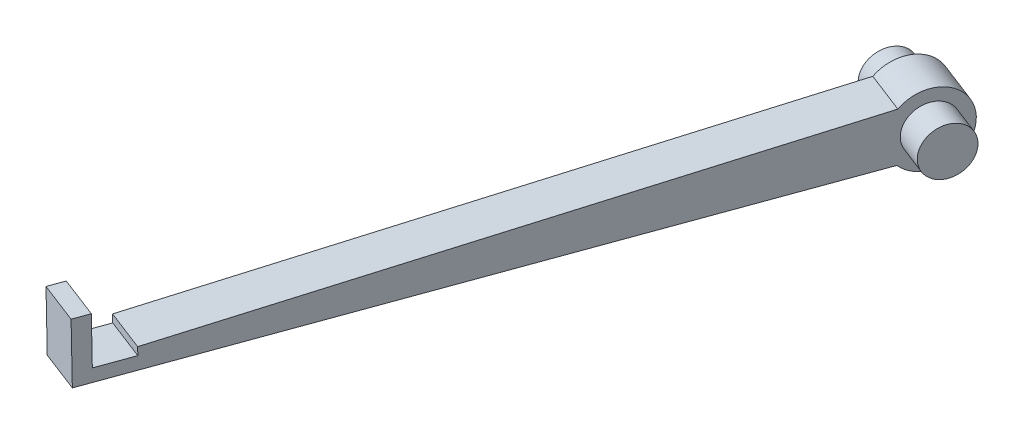
ISO-10303-21;
HEADER;
FILE_DESCRIPTION(('STEP AP214'),'2;1');
FILE_NAME('part.step','',(''),(''),'','','');
FILE_SCHEMA(('AUTOMOTIVE_DESIGN { 1 0 10303 214 1 1 1 1 }'));
ENDSEC;
DATA;
#1=APPLICATION_CONTEXT('core data for automotive mechanical design processes');
#2=APPLICATION_PROTOCOL_DEFINITION('international standard','automotive_design',2000,#1);
#3=PRODUCT_CONTEXT('',#1,'mechanical');
#4=PRODUCT('Part','Part','',(#3));
#5=PRODUCT_RELATED_PRODUCT_CATEGORY('part','',(#4));
#6=PRODUCT_DEFINITION_FORMATION('','',#4);
#7=PRODUCT_DEFINITION_CONTEXT('part definition',#1,'design');
#8=PRODUCT_DEFINITION('design','',#6,#7);
#9=PRODUCT_DEFINITION_SHAPE('','',#8);
#10=(LENGTH_UNIT() NAMED_UNIT(*) SI_UNIT(.MILLI.,.METRE.));
#11=(NAMED_UNIT(*) PLANE_ANGLE_UNIT() SI_UNIT($,.RADIAN.));
#12=(NAMED_UNIT(*) SI_UNIT($,.STERADIAN.) SOLID_ANGLE_UNIT());
#13=UNCERTAINTY_MEASURE_WITH_UNIT(LENGTH_MEASURE(1.E-05),#10,'distance_accuracy_value','');
#14=(GEOMETRIC_REPRESENTATION_CONTEXT(3) GLOBAL_UNCERTAINTY_ASSIGNED_CONTEXT((#13)) GLOBAL_UNIT_ASSIGNED_CONTEXT((#10,
#11,#12)) REPRESENTATION_CONTEXT('',''));
#15=CARTESIAN_POINT('',(0.,0.,0.));
#16=DIRECTION('',(0.,0.,1.));
#17=DIRECTION('',(1.,0.,0.));
#18=AXIS2_PLACEMENT_3D('',#15,#16,#17);
#19=CARTESIAN_POINT('',(26.891622941613,0.,10.3987511274411));
#20=DIRECTION('',(0.932695420734317,0.,0.360665013747156));
#21=DIRECTION('',(0.360665013747156,0.,-0.932695420734317));
#22=AXIS2_PLACEMENT_3D('',#19,#20,#21);
#23=PLANE('',#22);
#24=CARTESIAN_POINT('',(-24.160846501585,-75.3108358170327,142.422658775525));
#25=DIRECTION('',(0.932695420734317,0.,0.360665013747156));
#26=DIRECTION('',(0.360665013747156,0.,-0.932695420734317));
#27=AXIS2_PLACEMENT_3D('',#24,#25,#26);
#28=CIRCLE('',#27,2.25818076267929);
#29=CARTESIAN_POINT('',(-24.7608073240131,-76.8379894364918,143.974183571027));
#30=VERTEX_POINT('',#29);
#31=CARTESIAN_POINT('',(-24.7438569960584,-73.7340198965795,143.930349285303));
#32=VERTEX_POINT('',#31);
#33=EDGE_CURVE('E102',#30,#32,#28,.T.);
#34=ORIENTED_EDGE('',*,*,#33,.F.);
#35=DIRECTION('',(-0.360617667711503,-0.0162028177473248,0.932572981825746));
#36=VECTOR('',#35,1.);
#37=CARTESIAN_POINT('',(27.3270286511242,-74.4976445540192,9.27277301494448));
#38=LINE('',#37,#36);
#39=CARTESIAN_POINT('',(-39.4438606642466,-77.4977098510674,181.945198476383));
#40=VERTEX_POINT('',#39);
#41=EDGE_CURVE('E56',#30,#40,#38,.T.);
#42=ORIENTED_EDGE('',*,*,#41,.T.);
#43=DIRECTION('',(-0.00584378948558351,0.999868725732057,0.0151122939159237));
#44=VECTOR('',#43,1.);
#45=CARTESIAN_POINT('',(-39.8792663737574,-3.00006529704849,183.071176588878));
#46=LINE('',#45,#44);
#47=CARTESIAN_POINT('',(-39.4661784946289,-73.6791430322186,182.002913356964));
#48=VERTEX_POINT('',#47);
#49=EDGE_CURVE('E153',#40,#48,#46,.T.);
#50=ORIENTED_EDGE('',*,*,#49,.T.);
#51=DIRECTION('',(0.360617667711503,0.0162028177473353,-0.932572981825746));
#52=VECTOR('',#51,1.);
#53=CARTESIAN_POINT('',(27.3047108207416,-70.6790777351684,9.33048789552654));
#54=LINE('',#53,#52);
#55=CARTESIAN_POINT('',(-39.1055608269164,-73.6629402144712,181.070340375135));
#56=VERTEX_POINT('',#55);
#57=EDGE_CURVE('E151',#48,#56,#54,.T.);
#58=ORIENTED_EDGE('',*,*,#57,.T.);
#59=DIRECTION('',(0.00584378948558423,-0.999868725732057,-0.0151122939159255));
#60=VECTOR('',#59,1.);
#61=CARTESIAN_POINT('',(-39.5186487060459,-2.98386247930153,182.138603607052));
#62=LINE('',#61,#60);
#63=CARTESIAN_POINT('',(-39.0879640116184,-76.6737443054435,181.024834245008));
#64=VERTEX_POINT('',#63);
#65=EDGE_CURVE('E149',#56,#64,#62,.T.);
#66=ORIENTED_EDGE('',*,*,#65,.T.);
#67=DIRECTION('',(0.360617667711503,0.0162028177473302,-0.932572981825746));
#68=VECTOR('',#67,1.);
#69=CARTESIAN_POINT('',(27.3223076360405,-73.6898818261416,9.2849817653969));
#70=LINE('',#69,#68);
#71=CARTESIAN_POINT('',(-38.2778969511392,-76.6373473950332,178.92996557464));
#72=VERTEX_POINT('',#71);
#73=EDGE_CURVE('E147',#64,#72,#70,.T.);
#74=ORIENTED_EDGE('',*,*,#73,.T.);
#75=DIRECTION('',(-0.00584378948557188,0.999868725732057,0.0151122939158936));
#76=VECTOR('',#75,1.);
#77=CARTESIAN_POINT('',(-38.7085816455658,-2.94746556888498,180.043734936682));
#78=LINE('',#77,#76);
#79=CARTESIAN_POINT('',(-38.2808188458822,-76.1374130321675,178.937521721599));
#80=VERTEX_POINT('',#79);
#81=EDGE_CURVE('E145',#72,#80,#78,.T.);
#82=ORIENTED_EDGE('',*,*,#81,.T.);
#83=DIRECTION('',(-0.359927863143312,-0.0639026810581387,0.930789117193939));
#84=VECTOR('',#83,1.);
#85=CARTESIAN_POINT('',(28.3766754066817,-64.3028399647852,6.55834082723185));
#86=LINE('',#85,#84);
#87=EDGE_CURVE('E143',#32,#80,#86,.T.);
#88=ORIENTED_EDGE('',*,*,#87,.F.);
#89=EDGE_LOOP('',(#34,#42,#50,#58,#66,#74,#82,#88));
#90=FACE_BOUND('',#89,.T.);
#91=CARTESIAN_POINT('',(-24.1608465016115,-75.310835817045,142.422658775594));
#92=DIRECTION('',(0.932695420734317,0.,0.360665013747156));
#93=DIRECTION('',(0.360665013747156,0.,-0.932695420734317));
#94=AXIS2_PLACEMENT_3D('',#91,#92,#93);
#95=CIRCLE('',#94,1.49999999997648);
#96=CARTESIAN_POINT('',(-23.6198489809993,-75.310835817045,141.023615644514));
#97=VERTEX_POINT('',#96);
#98=EDGE_CURVE('E11',#97,#97,#95,.F.);
#99=ORIENTED_EDGE('',*,*,#98,.F.);
#100=EDGE_LOOP('',(#99));
#101=FACE_BOUND('',#100,.T.);
#102=ADVANCED_FACE('F35',(#90,#101),#23,.F.);
#103=CARTESIAN_POINT('',(29.5031701196691,0.,11.4086131659332));
#104=DIRECTION('',(0.932695420734317,0.,0.360665013747156));
#105=DIRECTION('',(0.360665013747156,0.,-0.932695420734317));
#106=AXIS2_PLACEMENT_3D('',#103,#104,#105);
#107=PLANE('',#106);
#108=CARTESIAN_POINT('',(-21.5492993235289,-75.3108358170327,143.432520814017));
#109=DIRECTION('',(0.932695420734317,0.,0.360665013747156));
#110=DIRECTION('',(0.360665013747156,0.,-0.932695420734317));
#111=AXIS2_PLACEMENT_3D('',#108,#109,#110);
#112=CIRCLE('',#111,2.25818076267929);
#113=CARTESIAN_POINT('',(-22.149260145957,-76.8379894364918,144.984045609519));
#114=VERTEX_POINT('',#113);
#115=CARTESIAN_POINT('',(-22.1323098180023,-73.7340198965795,144.940211323795));
#116=VERTEX_POINT('',#115);
#117=EDGE_CURVE('E100',#114,#116,#112,.T.);
#118=ORIENTED_EDGE('',*,*,#117,.T.);
#119=DIRECTION('',(-0.359927863143312,-0.0639026810581387,0.930789117193939));
#120=VECTOR('',#119,1.);
#121=CARTESIAN_POINT('',(30.9882225847378,-64.3028399647852,7.56820286572389));
#122=LINE('',#121,#120);
#123=CARTESIAN_POINT('',(-35.6692716678261,-76.1374130321675,179.947383760091));
#124=VERTEX_POINT('',#123);
#125=EDGE_CURVE('E108',#116,#124,#122,.T.);
#126=ORIENTED_EDGE('',*,*,#125,.T.);
#127=DIRECTION('',(-0.00584378948557188,0.999868725732057,0.0151122939158936));
#128=VECTOR('',#127,1.);
#129=CARTESIAN_POINT('',(-36.0970344675097,-2.94746556888498,181.053596975174));
#130=LINE('',#129,#128);
#131=CARTESIAN_POINT('',(-35.6663497730831,-76.6373473950332,179.939827613132));
#132=VERTEX_POINT('',#131);
#133=EDGE_CURVE('E114',#132,#124,#130,.T.);
#134=ORIENTED_EDGE('',*,*,#133,.F.);
#135=DIRECTION('',(0.360617667711503,0.0162028177473302,-0.932572981825746));
#136=VECTOR('',#135,1.);
#137=CARTESIAN_POINT('',(29.9338548140966,-73.6898818261416,10.2948438038889));
#138=LINE('',#137,#136);
#139=CARTESIAN_POINT('',(-36.4764168335623,-76.6737443054435,182.0346962835));
#140=VERTEX_POINT('',#139);
#141=EDGE_CURVE('E129',#140,#132,#138,.T.);
#142=ORIENTED_EDGE('',*,*,#141,.F.);
#143=DIRECTION('',(0.00584378948558423,-0.999868725732057,-0.0151122939159255));
#144=VECTOR('',#143,1.);
#145=CARTESIAN_POINT('',(-36.9071015279898,-2.98386247930153,183.148465645544));
#146=LINE('',#145,#144);
#147=CARTESIAN_POINT('',(-36.4940136488603,-73.6629402144712,182.080202413627));
#148=VERTEX_POINT('',#147);
#149=EDGE_CURVE('E132',#148,#140,#146,.T.);
#150=ORIENTED_EDGE('',*,*,#149,.F.);
#151=DIRECTION('',(0.360617667711503,0.0162028177473353,-0.932572981825746));
#152=VECTOR('',#151,1.);
#153=CARTESIAN_POINT('',(29.9162579987977,-70.6790777351684,10.3403499340186));
#154=LINE('',#153,#152);
#155=CARTESIAN_POINT('',(-36.8546313165728,-73.6791430322186,183.012775395456));
#156=VERTEX_POINT('',#155);
#157=EDGE_CURVE('E135',#156,#148,#154,.T.);
#158=ORIENTED_EDGE('',*,*,#157,.F.);
#159=DIRECTION('',(-0.00584378948558351,0.999868725732057,0.0151122939159237));
#160=VECTOR('',#159,1.);
#161=CARTESIAN_POINT('',(-37.2677191957013,-3.00006529704848,184.08103862737));
#162=LINE('',#161,#160);
#163=CARTESIAN_POINT('',(-36.8323134861905,-77.4977098510674,182.955060514875));
#164=VERTEX_POINT('',#163);
#165=EDGE_CURVE('E138',#164,#156,#162,.T.);
#166=ORIENTED_EDGE('',*,*,#165,.F.);
#167=DIRECTION('',(-0.360617667711503,-0.0162028177473248,0.932572981825746));
#168=VECTOR('',#167,1.);
#169=CARTESIAN_POINT('',(29.9385758291803,-74.4976445540192,10.2826350534365));
#170=LINE('',#169,#168);
#171=EDGE_CURVE('E120',#114,#164,#170,.T.);
#172=ORIENTED_EDGE('',*,*,#171,.F.);
#173=EDGE_LOOP('',(#118,#126,#134,#142,#150,#158,#166,#172));
#174=FACE_BOUND('',#173,.T.);
#175=CARTESIAN_POINT('',(-21.5492993235556,-75.310835817045,143.432520814086));
#176=DIRECTION('',(0.932695420734317,0.,0.360665013747156));
#177=DIRECTION('',(0.360665013747156,0.,-0.932695420734317));
#178=AXIS2_PLACEMENT_3D('',#175,#176,#177);
#179=CIRCLE('',#178,1.49999999997648);
#180=CARTESIAN_POINT('',(-21.0083018029433,-75.310835817045,142.033477683006));
#181=VERTEX_POINT('',#180);
#182=EDGE_CURVE('E124',#181,#181,#179,.T.);
#183=ORIENTED_EDGE('',*,*,#182,.F.);
#184=EDGE_LOOP('',(#183));
#185=FACE_BOUND('',#184,.T.);
#186=ADVANCED_FACE('F116',(#174,#185),#107,.T.);
#187=CARTESIAN_POINT('',(-24.160846501585,-75.3108358170327,142.422658775525));
#188=DIRECTION('',(0.932695420734317,0.,0.360665013747156));
#189=DIRECTION('',(0.360665013747156,0.,-0.932695420734317));
#190=AXIS2_PLACEMENT_3D('',#187,#188,#189);
#191=CYLINDRICAL_SURFACE('',#190,2.25818076267929);
#192=DIRECTION('',(0.932695420734317,0.,0.360665013747156));
#193=VECTOR('',#192,1.);
#194=CARTESIAN_POINT('',(-24.7438569960584,-73.7340198965795,143.930349285303));
#195=LINE('',#194,#193);
#196=EDGE_CURVE('E97',#32,#116,#195,.T.);
#197=ORIENTED_EDGE('',*,*,#196,.T.);
#198=ORIENTED_EDGE('',*,*,#117,.F.);
#199=DIRECTION('',(0.932695420734317,0.,0.360665013747156));
#200=VECTOR('',#199,1.);
#201=CARTESIAN_POINT('',(-24.7608073240131,-76.8379894364918,143.974183571027));
#202=LINE('',#201,#200);
#203=EDGE_CURVE('E43',#30,#114,#202,.T.);
#204=ORIENTED_EDGE('',*,*,#203,.F.);
#205=ORIENTED_EDGE('',*,*,#33,.T.);
#206=EDGE_LOOP('',(#197,#198,#204,#205));
#207=FACE_BOUND('',#206,.T.);
#208=ADVANCED_FACE('F37',(#207),#191,.T.);
#209=CARTESIAN_POINT('',(27.3270286511242,-74.4976445540192,9.27277301494448));
#210=DIRECTION('',(-0.00584378948558289,0.999868725732057,0.0151122939159221));
#211=DIRECTION('',(0.,-0.0151125519640096,0.999885798865618));
#212=AXIS2_PLACEMENT_3D('',#209,#210,#211);
#213=PLANE('',#212);
#214=ORIENTED_EDGE('',*,*,#203,.T.);
#215=ORIENTED_EDGE('',*,*,#171,.T.);
#216=DIRECTION('',(0.932695420734317,0.,0.360665013747156));
#217=VECTOR('',#216,1.);
#218=CARTESIAN_POINT('',(-39.4438606642466,-77.4977098510674,181.945198476383));
#219=LINE('',#218,#217);
#220=EDGE_CURVE('E157',#40,#164,#219,.T.);
#221=ORIENTED_EDGE('',*,*,#220,.F.);
#222=ORIENTED_EDGE('',*,*,#41,.F.);
#223=EDGE_LOOP('',(#214,#215,#221,#222));
#224=FACE_BOUND('',#223,.T.);
#225=ADVANCED_FACE('F190',(#224),#213,.F.);
#226=CARTESIAN_POINT('',(-39.8792663737574,-3.00006529704849,183.071176588878));
#227=DIRECTION('',(0.360617667711503,0.0162028177473265,-0.932572981825746));
#228=DIRECTION('',(-0.932695420734317,0.,-0.360665013747156));
#229=AXIS2_PLACEMENT_3D('',#226,#227,#228);
#230=PLANE('',#229);
#231=ORIENTED_EDGE('',*,*,#220,.T.);
#232=ORIENTED_EDGE('',*,*,#165,.T.);
#233=DIRECTION('',(0.932695420734317,0.,0.360665013747156));
#234=VECTOR('',#233,1.);
#235=CARTESIAN_POINT('',(-39.4661784946289,-73.6791430322186,182.002913356964));
#236=LINE('',#235,#234);
#237=EDGE_CURVE('E159',#48,#156,#236,.T.);
#238=ORIENTED_EDGE('',*,*,#237,.F.);
#239=ORIENTED_EDGE('',*,*,#49,.F.);
#240=EDGE_LOOP('',(#231,#232,#238,#239));
#241=FACE_BOUND('',#240,.T.);
#242=ADVANCED_FACE('F188',(#241),#230,.F.);
#243=CARTESIAN_POINT('',(27.3047108207416,-70.6790777351684,9.33048789552654));
#244=DIRECTION('',(0.00584378948558668,-0.999868725732057,-0.0151122939159319));
#245=DIRECTION('',(0.,0.0151125519640194,-0.999885798865618));
#246=AXIS2_PLACEMENT_3D('',#243,#244,#245);
#247=PLANE('',#246);
#248=ORIENTED_EDGE('',*,*,#237,.T.);
#249=ORIENTED_EDGE('',*,*,#157,.T.);
#250=DIRECTION('',(0.932695420734317,0.,0.360665013747156));
#251=VECTOR('',#250,1.);
#252=CARTESIAN_POINT('',(-39.1055608269164,-73.6629402144712,181.070340375135));
#253=LINE('',#252,#251);
#254=EDGE_CURVE('E161',#56,#148,#253,.T.);
#255=ORIENTED_EDGE('',*,*,#254,.F.);
#256=ORIENTED_EDGE('',*,*,#57,.F.);
#257=EDGE_LOOP('',(#248,#249,#255,#256));
#258=FACE_BOUND('',#257,.T.);
#259=ADVANCED_FACE('F183',(#258),#247,.F.);
#260=CARTESIAN_POINT('',(-39.5186487060459,-2.98386247930153,182.138603607052));
#261=DIRECTION('',(-0.360617667711503,-0.0162028177473286,0.932572981825746));
#262=DIRECTION('',(0.932695420734317,0.,0.360665013747156));
#263=AXIS2_PLACEMENT_3D('',#260,#261,#262);
#264=PLANE('',#263);
#265=ORIENTED_EDGE('',*,*,#254,.T.);
#266=ORIENTED_EDGE('',*,*,#149,.T.);
#267=DIRECTION('',(0.932695420734317,0.,0.360665013747156));
#268=VECTOR('',#267,1.);
#269=CARTESIAN_POINT('',(-39.0879640116184,-76.6737443054435,181.024834245008));
#270=LINE('',#269,#268);
#271=EDGE_CURVE('E163',#64,#140,#270,.T.);
#272=ORIENTED_EDGE('',*,*,#271,.F.);
#273=ORIENTED_EDGE('',*,*,#65,.F.);
#274=EDGE_LOOP('',(#265,#266,#272,#273));
#275=FACE_BOUND('',#274,.T.);
#276=ADVANCED_FACE('F179',(#275),#264,.F.);
#277=CARTESIAN_POINT('',(27.3223076360405,-73.6898818261416,9.2849817653969));
#278=DIRECTION('',(0.00584378948558482,-0.999868725732057,-0.0151122939159271));
#279=DIRECTION('',(0.,0.0151125519640146,-0.999885798865618));
#280=AXIS2_PLACEMENT_3D('',#277,#278,#279);
#281=PLANE('',#280);
#282=ORIENTED_EDGE('',*,*,#271,.T.);
#283=ORIENTED_EDGE('',*,*,#141,.T.);
#284=DIRECTION('',(0.932695420734317,0.,0.360665013747156));
#285=VECTOR('',#284,1.);
#286=CARTESIAN_POINT('',(-38.2778969511392,-76.6373473950332,178.92996557464));
#287=LINE('',#286,#285);
#288=EDGE_CURVE('E165',#72,#132,#287,.T.);
#289=ORIENTED_EDGE('',*,*,#288,.F.);
#290=ORIENTED_EDGE('',*,*,#73,.F.);
#291=EDGE_LOOP('',(#282,#283,#289,#290));
#292=FACE_BOUND('',#291,.T.);
#293=ADVANCED_FACE('F175',(#292),#281,.F.);
#294=CARTESIAN_POINT('',(-38.7085816455658,-2.94746556888498,180.043734936682));
#295=DIRECTION('',(0.360617667711503,0.0162028177472943,-0.932572981825746));
#296=DIRECTION('',(-0.932695420734317,0.,-0.360665013747156));
#297=AXIS2_PLACEMENT_3D('',#294,#295,#296);
#298=PLANE('',#297);
#299=ORIENTED_EDGE('',*,*,#288,.T.);
#300=ORIENTED_EDGE('',*,*,#133,.T.);
#301=DIRECTION('',(0.932695420734317,0.,0.360665013747156));
#302=VECTOR('',#301,1.);
#303=CARTESIAN_POINT('',(-38.2808188458822,-76.1374130321675,178.937521721599));
#304=LINE('',#303,#302);
#305=EDGE_CURVE('E106',#80,#124,#304,.T.);
#306=ORIENTED_EDGE('',*,*,#305,.F.);
#307=ORIENTED_EDGE('',*,*,#81,.F.);
#308=EDGE_LOOP('',(#299,#300,#306,#307));
#309=FACE_BOUND('',#308,.T.);
#310=ADVANCED_FACE('F170',(#309),#298,.F.);
#311=CARTESIAN_POINT('',(28.3766754066817,-64.3028399647852,6.55834082723185));
#312=DIRECTION('',(-0.023047461342315,0.997956134984691,0.059601737995571));
#313=DIRECTION('',(0.,-0.0596175740935131,0.998221290525906));
#314=AXIS2_PLACEMENT_3D('',#311,#312,#313);
#315=PLANE('',#314);
#316=ORIENTED_EDGE('',*,*,#305,.T.);
#317=ORIENTED_EDGE('',*,*,#125,.F.);
#318=ORIENTED_EDGE('',*,*,#196,.F.);
#319=ORIENTED_EDGE('',*,*,#87,.T.);
#320=EDGE_LOOP('',(#316,#317,#318,#319));
#321=FACE_BOUND('',#320,.T.);
#322=ADVANCED_FACE('F109',(#321),#315,.T.);
#323=CARTESIAN_POINT('',(-19.7771780241604,-75.310835817045,144.117784340205));
#324=DIRECTION('',(-0.932695420734317,0.,-0.360665013747156));
#325=DIRECTION('',(-0.360665013747156,0.,0.932695420734317));
#326=AXIS2_PLACEMENT_3D('',#323,#324,#325);
#327=CYLINDRICAL_SURFACE('',#326,1.49999999997648);
#328=CARTESIAN_POINT('',(-19.7771780241604,-75.310835817045,144.117784340205));
#329=DIRECTION('',(0.932695420734317,0.,0.360665013747156));
#330=DIRECTION('',(0.360665013747156,0.,-0.932695420734317));
#331=AXIS2_PLACEMENT_3D('',#328,#329,#330);
#332=CIRCLE('',#331,1.49999999997648);
#333=CARTESIAN_POINT('',(-19.2361805035481,-75.310835817045,142.718741209126));
#334=VERTEX_POINT('',#333);
#335=EDGE_CURVE('E121',#334,#334,#332,.T.);
#336=ORIENTED_EDGE('',*,*,#335,.F.);
#337=EDGE_LOOP('',(#336));
#338=FACE_BOUND('',#337,.T.);
#339=ORIENTED_EDGE('',*,*,#182,.T.);
#340=EDGE_LOOP('',(#339));
#341=FACE_BOUND('',#340,.T.);
#342=ADVANCED_FACE('F208',(#338,#341),#327,.T.);
#343=CARTESIAN_POINT('',(31.2752914190643,0.,12.0938766920528));
#344=DIRECTION('',(0.932695420734317,0.,0.360665013747156));
#345=DIRECTION('',(0.360665013747156,0.,-0.932695420734317));
#346=AXIS2_PLACEMENT_3D('',#343,#344,#345);
#347=PLANE('',#346);
#348=ORIENTED_EDGE('',*,*,#335,.T.);
#349=EDGE_LOOP('',(#348));
#350=FACE_BOUND('',#349,.T.);
#351=ADVANCED_FACE('F199',(#350),#347,.T.);
#352=CARTESIAN_POINT('',(-25.9329678010068,-75.310835817045,141.737395249474));
#353=DIRECTION('',(0.932695420734317,0.,0.360665013747156));
#354=DIRECTION('',(0.360665013747156,0.,-0.932695420734317));
#355=AXIS2_PLACEMENT_3D('',#352,#353,#354);
#356=CYLINDRICAL_SURFACE('',#355,1.49999999997648);
#357=CARTESIAN_POINT('',(-25.9329678010068,-75.310835817045,141.737395249474));
#358=DIRECTION('',(-0.932695420734317,0.,-0.360665013747156));
#359=DIRECTION('',(-0.360665013747156,0.,0.932695420734317));
#360=AXIS2_PLACEMENT_3D('',#357,#358,#359);
#361=CIRCLE('',#360,1.49999999997648);
#362=CARTESIAN_POINT('',(-26.4739653216191,-75.310835817045,143.136438380554));
#363=VERTEX_POINT('',#362);
#364=EDGE_CURVE('E335',#363,#363,#361,.T.);
#365=ORIENTED_EDGE('',*,*,#364,.F.);
#366=EDGE_LOOP('',(#365));
#367=FACE_BOUND('',#366,.T.);
#368=ORIENTED_EDGE('',*,*,#98,.T.);
#369=EDGE_LOOP('',(#368));
#370=FACE_BOUND('',#369,.T.);
#371=ADVANCED_FACE('F196',(#367,#370),#356,.T.);
#372=CARTESIAN_POINT('',(25.1195016422178,0.,9.71348760132155));
#373=DIRECTION('',(-0.932695420734317,0.,-0.360665013747156));
#374=DIRECTION('',(-0.360665013747156,0.,0.932695420734317));
#375=AXIS2_PLACEMENT_3D('',#372,#373,#374);
#376=PLANE('',#375);
#377=ORIENTED_EDGE('',*,*,#364,.T.);
#378=EDGE_LOOP('',(#377));
#379=FACE_BOUND('',#378,.T.);
#380=ADVANCED_FACE('F198',(#379),#376,.T.);
#381=CLOSED_SHELL('',(#102,#186,#208,#225,#242,#259,#276,#293,#310,#322,#342,#351,#371,#380));
#382=MANIFOLD_SOLID_BREP('B2',#381);
#383=ADVANCED_BREP_SHAPE_REPRESENTATION('',(#18,#382),#14);
#384=SHAPE_DEFINITION_REPRESENTATION(#9,#383);
ENDSEC;
END-ISO-10303-21;
